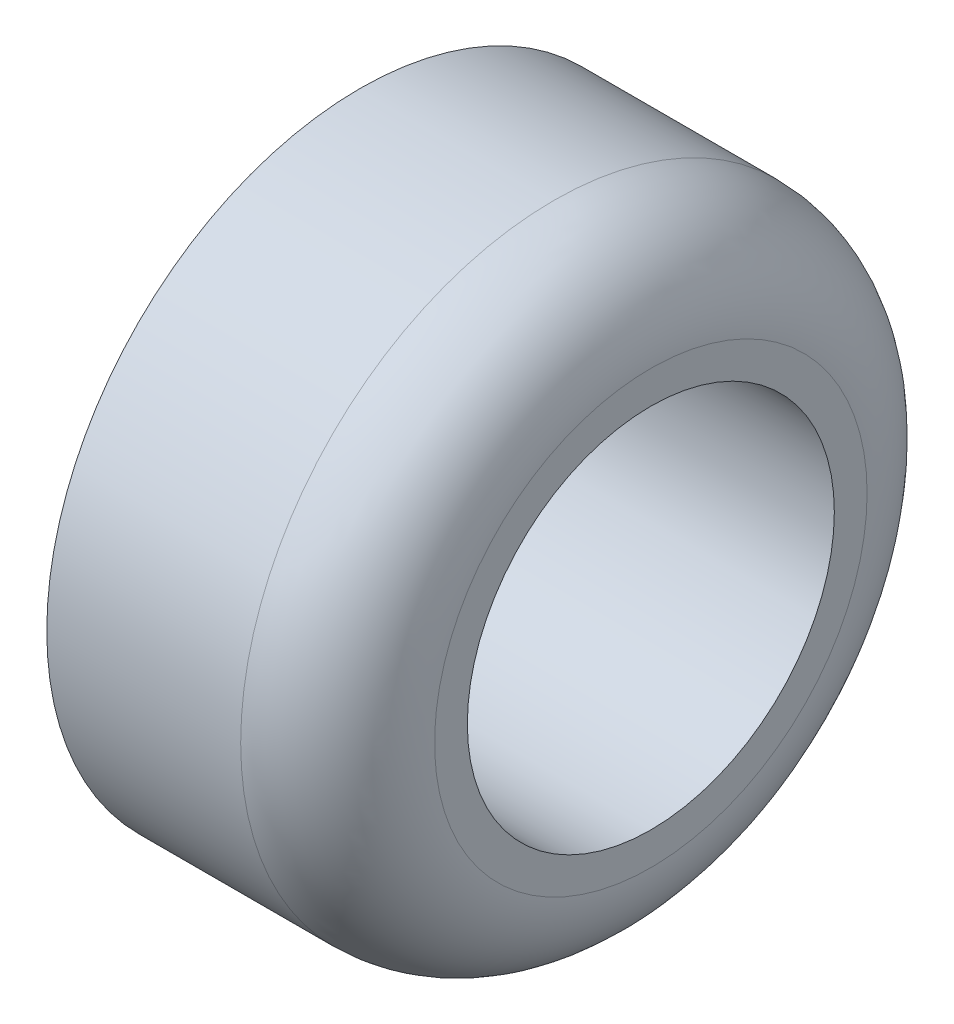
ISO-10303-21;
HEADER;
FILE_DESCRIPTION(('STEP AP214'),'2;1');
FILE_NAME('part.step','',(''),(''),'','','');
FILE_SCHEMA(('AUTOMOTIVE_DESIGN { 1 0 10303 214 1 1 1 1 }'));
ENDSEC;
DATA;
#1=APPLICATION_CONTEXT('core data for automotive mechanical design processes');
#2=APPLICATION_PROTOCOL_DEFINITION('international standard','automotive_design',2000,#1);
#3=PRODUCT_CONTEXT('',#1,'mechanical');
#4=PRODUCT('Part','Part','',(#3));
#5=PRODUCT_RELATED_PRODUCT_CATEGORY('part','',(#4));
#6=PRODUCT_DEFINITION_FORMATION('','',#4);
#7=PRODUCT_DEFINITION_CONTEXT('part definition',#1,'design');
#8=PRODUCT_DEFINITION('design','',#6,#7);
#9=PRODUCT_DEFINITION_SHAPE('','',#8);
#10=(LENGTH_UNIT() NAMED_UNIT(*) SI_UNIT(.MILLI.,.METRE.));
#11=(NAMED_UNIT(*) PLANE_ANGLE_UNIT() SI_UNIT($,.RADIAN.));
#12=(NAMED_UNIT(*) SI_UNIT($,.STERADIAN.) SOLID_ANGLE_UNIT());
#13=UNCERTAINTY_MEASURE_WITH_UNIT(LENGTH_MEASURE(1.E-05),#10,'distance_accuracy_value','');
#14=(GEOMETRIC_REPRESENTATION_CONTEXT(3) GLOBAL_UNCERTAINTY_ASSIGNED_CONTEXT((#13)) GLOBAL_UNIT_ASSIGNED_CONTEXT((#10,
#11,#12)) REPRESENTATION_CONTEXT('',''));
#15=CARTESIAN_POINT('',(0.,0.,0.));
#16=DIRECTION('',(0.,0.,1.));
#17=DIRECTION('',(1.,0.,0.));
#18=AXIS2_PLACEMENT_3D('',#15,#16,#17);
#19=CARTESIAN_POINT('',(-3.9624,0.,0.));
#20=DIRECTION('',(1.,0.,0.));
#21=DIRECTION('',(0.,0.,-1.));
#22=AXIS2_PLACEMENT_3D('',#19,#20,#21);
#23=CYLINDRICAL_SURFACE('',#22,4.2672);
#24=CARTESIAN_POINT('',(-1.320798984,0.,0.));
#25=DIRECTION('',(1.,0.,0.));
#26=DIRECTION('',(0.,0.,-1.));
#27=AXIS2_PLACEMENT_3D('',#24,#25,#26);
#28=CIRCLE('',#27,4.2672);
#29=CARTESIAN_POINT('',(-1.320798984,0.,-4.2672));
#30=VERTEX_POINT('',#29);
#31=EDGE_CURVE('E10',#30,#30,#28,.F.);
#32=ORIENTED_EDGE('',*,*,#31,.T.);
#33=EDGE_LOOP('',(#32));
#34=FACE_BOUND('',#33,.T.);
#35=CARTESIAN_POINT('',(-3.9624,0.,0.));
#36=DIRECTION('',(1.,0.,0.));
#37=DIRECTION('',(0.,0.,-1.));
#38=AXIS2_PLACEMENT_3D('',#35,#36,#37);
#39=CIRCLE('',#38,4.2672);
#40=CARTESIAN_POINT('',(-3.9624,0.,-4.2672));
#41=VERTEX_POINT('',#40);
#42=EDGE_CURVE('E45',#41,#41,#39,.T.);
#43=ORIENTED_EDGE('',*,*,#42,.T.);
#44=EDGE_LOOP('',(#43));
#45=FACE_BOUND('',#44,.T.);
#46=ADVANCED_FACE('F34',(#34,#45),#23,.T.);
#47=CARTESIAN_POINT('',(-3.9624,0.,0.));
#48=DIRECTION('',(1.,0.,0.));
#49=DIRECTION('',(0.,0.,-1.));
#50=AXIS2_PLACEMENT_3D('',#47,#48,#49);
#51=PLANE('',#50);
#52=CARTESIAN_POINT('',(-3.9624,0.,0.));
#53=DIRECTION('',(1.,0.,0.));
#54=DIRECTION('',(0.,0.,-1.));
#55=AXIS2_PLACEMENT_3D('',#52,#53,#54);
#56=CIRCLE('',#55,2.50000008);
#57=CARTESIAN_POINT('',(-3.9624,0.,-2.50000008));
#58=VERTEX_POINT('',#57);
#59=EDGE_CURVE('E49',#58,#58,#56,.T.);
#60=ORIENTED_EDGE('',*,*,#59,.T.);
#61=EDGE_LOOP('',(#60));
#62=FACE_BOUND('',#61,.T.);
#63=ORIENTED_EDGE('',*,*,#42,.F.);
#64=EDGE_LOOP('',(#63));
#65=FACE_BOUND('',#64,.T.);
#66=ADVANCED_FACE('F58',(#62,#65),#51,.F.);
#67=CARTESIAN_POINT('',(0.,0.,0.));
#68=DIRECTION('',(1.,0.,0.));
#69=DIRECTION('',(0.,0.,-1.));
#70=AXIS2_PLACEMENT_3D('',#67,#68,#69);
#71=PLANE('',#70);
#72=CARTESIAN_POINT('',(0.,0.,0.));
#73=DIRECTION('',(1.,0.,0.));
#74=DIRECTION('',(0.,0.,-1.));
#75=AXIS2_PLACEMENT_3D('',#72,#73,#74);
#76=CIRCLE('',#75,2.946401016);
#77=CARTESIAN_POINT('',(0.,0.,-2.946401016));
#78=VERTEX_POINT('',#77);
#79=EDGE_CURVE('E41',#78,#78,#76,.T.);
#80=ORIENTED_EDGE('',*,*,#79,.T.);
#81=EDGE_LOOP('',(#80));
#82=FACE_BOUND('',#81,.T.);
#83=CARTESIAN_POINT('',(0.,0.,0.));
#84=DIRECTION('',(1.,0.,0.));
#85=DIRECTION('',(0.,0.,-1.));
#86=AXIS2_PLACEMENT_3D('',#83,#84,#85);
#87=CIRCLE('',#86,2.50000008);
#88=CARTESIAN_POINT('',(0.,0.,-2.50000008));
#89=VERTEX_POINT('',#88);
#90=EDGE_CURVE('E52',#89,#89,#87,.T.);
#91=ORIENTED_EDGE('',*,*,#90,.F.);
#92=EDGE_LOOP('',(#91));
#93=FACE_BOUND('',#92,.T.);
#94=ADVANCED_FACE('F64',(#82,#93),#71,.T.);
#95=CARTESIAN_POINT('',(-3.9624,0.,0.));
#96=DIRECTION('',(1.,0.,0.));
#97=DIRECTION('',(0.,0.,-1.));
#98=AXIS2_PLACEMENT_3D('',#95,#96,#97);
#99=CYLINDRICAL_SURFACE('',#98,2.50000008);
#100=ORIENTED_EDGE('',*,*,#59,.F.);
#101=EDGE_LOOP('',(#100));
#102=FACE_BOUND('',#101,.T.);
#103=ORIENTED_EDGE('',*,*,#90,.T.);
#104=EDGE_LOOP('',(#103));
#105=FACE_BOUND('',#104,.T.);
#106=ADVANCED_FACE('F61',(#102,#105),#99,.F.);
#107=CARTESIAN_POINT('',(-1.320798984,0.,0.));
#108=DIRECTION('',(1.,0.,0.));
#109=DIRECTION('',(0.,0.,-1.));
#110=AXIS2_PLACEMENT_3D('',#107,#108,#109);
#111=TOROIDAL_SURFACE('',#110,2.946401016,1.320798984);
#112=ORIENTED_EDGE('',*,*,#31,.F.);
#113=EDGE_LOOP('',(#112));
#114=FACE_BOUND('',#113,.T.);
#115=ORIENTED_EDGE('',*,*,#79,.F.);
#116=EDGE_LOOP('',(#115));
#117=FACE_BOUND('',#116,.T.);
#118=ADVANCED_FACE('F36',(#114,#117),#111,.T.);
#119=CLOSED_SHELL('',(#46,#66,#94,#106,#118));
#120=MANIFOLD_SOLID_BREP('B2',#119);
#121=ADVANCED_BREP_SHAPE_REPRESENTATION('',(#18,#120),#14);
#122=SHAPE_DEFINITION_REPRESENTATION(#9,#121);
ENDSEC;
END-ISO-10303-21;
